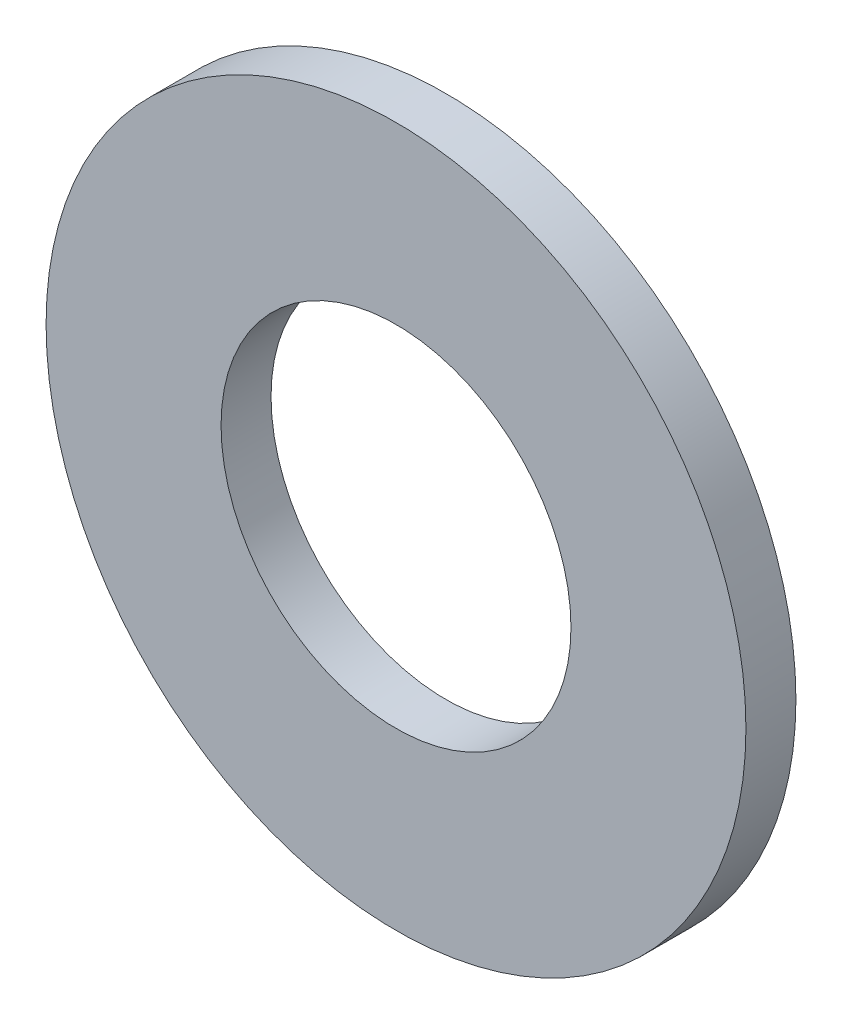
ISO-10303-21;
HEADER;
FILE_DESCRIPTION(('STEP AP214'),'2;1');
FILE_NAME('part.step','',(''),(''),'','','');
FILE_SCHEMA(('AUTOMOTIVE_DESIGN { 1 0 10303 214 1 1 1 1 }'));
ENDSEC;
DATA;
#1=APPLICATION_CONTEXT('core data for automotive mechanical design processes');
#2=APPLICATION_PROTOCOL_DEFINITION('international standard','automotive_design',2000,#1);
#3=PRODUCT_CONTEXT('',#1,'mechanical');
#4=PRODUCT('Part','Part','',(#3));
#5=PRODUCT_RELATED_PRODUCT_CATEGORY('part','',(#4));
#6=PRODUCT_DEFINITION_FORMATION('','',#4);
#7=PRODUCT_DEFINITION_CONTEXT('part definition',#1,'design');
#8=PRODUCT_DEFINITION('design','',#6,#7);
#9=PRODUCT_DEFINITION_SHAPE('','',#8);
#10=(LENGTH_UNIT() NAMED_UNIT(*) SI_UNIT(.MILLI.,.METRE.));
#11=(NAMED_UNIT(*) PLANE_ANGLE_UNIT() SI_UNIT($,.RADIAN.));
#12=(NAMED_UNIT(*) SI_UNIT($,.STERADIAN.) SOLID_ANGLE_UNIT());
#13=UNCERTAINTY_MEASURE_WITH_UNIT(LENGTH_MEASURE(1.E-05),#10,'distance_accuracy_value','');
#14=(GEOMETRIC_REPRESENTATION_CONTEXT(3) GLOBAL_UNCERTAINTY_ASSIGNED_CONTEXT((#13)) GLOBAL_UNIT_ASSIGNED_CONTEXT((#10,
#11,#12)) REPRESENTATION_CONTEXT('',''));
#15=CARTESIAN_POINT('',(0.,0.,0.));
#16=DIRECTION('',(0.,0.,1.));
#17=DIRECTION('',(1.,0.,0.));
#18=AXIS2_PLACEMENT_3D('',#15,#16,#17);
#19=CARTESIAN_POINT('',(0.,0.,2.));
#20=DIRECTION('',(0.,0.,1.));
#21=DIRECTION('',(1.,0.,0.));
#22=AXIS2_PLACEMENT_3D('',#19,#20,#21);
#23=PLANE('',#22);
#24=CARTESIAN_POINT('',(0.,0.,2.));
#25=DIRECTION('',(0.,0.,1.));
#26=DIRECTION('',(1.,0.,0.));
#27=AXIS2_PLACEMENT_3D('',#24,#25,#26);
#28=CIRCLE('',#27,14.);
#29=CARTESIAN_POINT('',(14.,0.,2.));
#30=VERTEX_POINT('',#29);
#31=EDGE_CURVE('E10',#30,#30,#28,.T.);
#32=ORIENTED_EDGE('',*,*,#31,.T.);
#33=EDGE_LOOP('',(#32));
#34=FACE_BOUND('',#33,.T.);
#35=CARTESIAN_POINT('',(0.,0.,2.));
#36=DIRECTION('',(0.,0.,1.));
#37=DIRECTION('',(1.,0.,0.));
#38=AXIS2_PLACEMENT_3D('',#35,#36,#37);
#39=CIRCLE('',#38,7.);
#40=CARTESIAN_POINT('',(7.,0.,2.));
#41=VERTEX_POINT('',#40);
#42=EDGE_CURVE('E45',#41,#41,#39,.T.);
#43=ORIENTED_EDGE('',*,*,#42,.F.);
#44=EDGE_LOOP('',(#43));
#45=FACE_BOUND('',#44,.T.);
#46=ADVANCED_FACE('F34',(#34,#45),#23,.T.);
#47=CARTESIAN_POINT('',(0.,0.,0.));
#48=DIRECTION('',(0.,0.,1.));
#49=DIRECTION('',(1.,0.,0.));
#50=AXIS2_PLACEMENT_3D('',#47,#48,#49);
#51=PLANE('',#50);
#52=CARTESIAN_POINT('',(0.,0.,0.));
#53=DIRECTION('',(0.,0.,1.));
#54=DIRECTION('',(1.,0.,0.));
#55=AXIS2_PLACEMENT_3D('',#52,#53,#54);
#56=CIRCLE('',#55,14.);
#57=CARTESIAN_POINT('',(14.,0.,0.));
#58=VERTEX_POINT('',#57);
#59=EDGE_CURVE('E38',#58,#58,#56,.T.);
#60=ORIENTED_EDGE('',*,*,#59,.F.);
#61=EDGE_LOOP('',(#60));
#62=FACE_BOUND('',#61,.T.);
#63=CARTESIAN_POINT('',(0.,0.,0.));
#64=DIRECTION('',(0.,0.,1.));
#65=DIRECTION('',(1.,0.,0.));
#66=AXIS2_PLACEMENT_3D('',#63,#64,#65);
#67=CIRCLE('',#66,7.);
#68=CARTESIAN_POINT('',(7.,0.,0.));
#69=VERTEX_POINT('',#68);
#70=EDGE_CURVE('E47',#69,#69,#67,.T.);
#71=ORIENTED_EDGE('',*,*,#70,.T.);
#72=EDGE_LOOP('',(#71));
#73=FACE_BOUND('',#72,.T.);
#74=ADVANCED_FACE('F57',(#62,#73),#51,.F.);
#75=CARTESIAN_POINT('',(0.,0.,2.));
#76=DIRECTION('',(0.,0.,-1.));
#77=DIRECTION('',(-1.,0.,0.));
#78=AXIS2_PLACEMENT_3D('',#75,#76,#77);
#79=CYLINDRICAL_SURFACE('',#78,14.);
#80=ORIENTED_EDGE('',*,*,#31,.F.);
#81=EDGE_LOOP('',(#80));
#82=FACE_BOUND('',#81,.T.);
#83=ORIENTED_EDGE('',*,*,#59,.T.);
#84=EDGE_LOOP('',(#83));
#85=FACE_BOUND('',#84,.T.);
#86=ADVANCED_FACE('F36',(#82,#85),#79,.T.);
#87=CARTESIAN_POINT('',(0.,0.,2.));
#88=DIRECTION('',(0.,0.,-1.));
#89=DIRECTION('',(-1.,0.,0.));
#90=AXIS2_PLACEMENT_3D('',#87,#88,#89);
#91=CYLINDRICAL_SURFACE('',#90,7.);
#92=ORIENTED_EDGE('',*,*,#42,.T.);
#93=EDGE_LOOP('',(#92));
#94=FACE_BOUND('',#93,.T.);
#95=ORIENTED_EDGE('',*,*,#70,.F.);
#96=EDGE_LOOP('',(#95));
#97=FACE_BOUND('',#96,.T.);
#98=ADVANCED_FACE('F53',(#94,#97),#91,.F.);
#99=CLOSED_SHELL('',(#46,#74,#86,#98));
#100=MANIFOLD_SOLID_BREP('B2',#99);
#101=ADVANCED_BREP_SHAPE_REPRESENTATION('',(#18,#100),#14);
#102=SHAPE_DEFINITION_REPRESENTATION(#9,#101);
ENDSEC;
END-ISO-10303-21;
